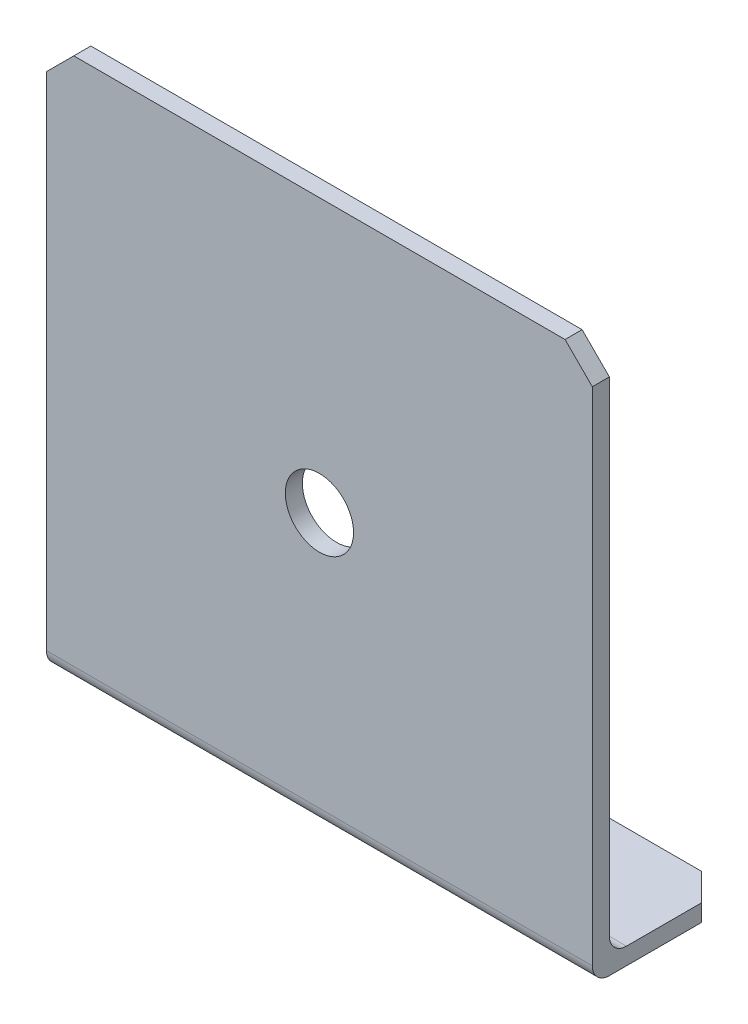
ISO-10303-21;
HEADER;
FILE_DESCRIPTION(('STEP AP214'),'2;1');
FILE_NAME('part.step','',(''),(''),'','','');
FILE_SCHEMA(('AUTOMOTIVE_DESIGN { 1 0 10303 214 1 1 1 1 }'));
ENDSEC;
DATA;
#1=APPLICATION_CONTEXT('core data for automotive mechanical design processes');
#2=APPLICATION_PROTOCOL_DEFINITION('international standard','automotive_design',2000,#1);
#3=PRODUCT_CONTEXT('',#1,'mechanical');
#4=PRODUCT('Part','Part','',(#3));
#5=PRODUCT_RELATED_PRODUCT_CATEGORY('part','',(#4));
#6=PRODUCT_DEFINITION_FORMATION('','',#4);
#7=PRODUCT_DEFINITION_CONTEXT('part definition',#1,'design');
#8=PRODUCT_DEFINITION('design','',#6,#7);
#9=PRODUCT_DEFINITION_SHAPE('','',#8);
#10=(LENGTH_UNIT() NAMED_UNIT(*) SI_UNIT(.MILLI.,.METRE.));
#11=(NAMED_UNIT(*) PLANE_ANGLE_UNIT() SI_UNIT($,.RADIAN.));
#12=(NAMED_UNIT(*) SI_UNIT($,.STERADIAN.) SOLID_ANGLE_UNIT());
#13=UNCERTAINTY_MEASURE_WITH_UNIT(LENGTH_MEASURE(1.E-05),#10,'distance_accuracy_value','');
#14=(GEOMETRIC_REPRESENTATION_CONTEXT(3) GLOBAL_UNCERTAINTY_ASSIGNED_CONTEXT((#13)) GLOBAL_UNIT_ASSIGNED_CONTEXT((#10,
#11,#12)) REPRESENTATION_CONTEXT('',''));
#15=CARTESIAN_POINT('',(0.,0.,0.));
#16=DIRECTION('',(0.,0.,1.));
#17=DIRECTION('',(1.,0.,0.));
#18=AXIS2_PLACEMENT_3D('',#15,#16,#17);
#19=CARTESIAN_POINT('',(50.8,50.8,0.));
#20=DIRECTION('',(0.,-1.,0.));
#21=DIRECTION('',(0.,0.,-1.));
#22=AXIS2_PLACEMENT_3D('',#19,#20,#21);
#23=PLANE('',#22);
#24=DIRECTION('',(-1.,0.,0.));
#25=VECTOR('',#24,1.);
#26=CARTESIAN_POINT('',(50.8,50.8,-1.5875));
#27=LINE('',#26,#25);
#28=CARTESIAN_POINT('',(48.26,50.8,-1.5875));
#29=VERTEX_POINT('',#28);
#30=CARTESIAN_POINT('',(2.54,50.8,-1.5875));
#31=VERTEX_POINT('',#30);
#32=EDGE_CURVE('E166',#29,#31,#27,.T.);
#33=ORIENTED_EDGE('',*,*,#32,.T.);
#34=DIRECTION('',(0.,0.,1.));
#35=VECTOR('',#34,1.);
#36=CARTESIAN_POINT('',(2.54,50.8,0.));
#37=LINE('',#36,#35);
#38=CARTESIAN_POINT('',(2.54,50.8,0.));
#39=VERTEX_POINT('',#38);
#40=EDGE_CURVE('E226',#31,#39,#37,.T.);
#41=ORIENTED_EDGE('',*,*,#40,.T.);
#42=DIRECTION('',(-1.,0.,0.));
#43=VECTOR('',#42,1.);
#44=CARTESIAN_POINT('',(50.8,50.8,0.));
#45=LINE('',#44,#43);
#46=CARTESIAN_POINT('',(48.26,50.8,0.));
#47=VERTEX_POINT('',#46);
#48=EDGE_CURVE('E149',#47,#39,#45,.T.);
#49=ORIENTED_EDGE('',*,*,#48,.F.);
#50=DIRECTION('',(0.,0.,-1.));
#51=VECTOR('',#50,1.);
#52=CARTESIAN_POINT('',(48.26,50.8,0.));
#53=LINE('',#52,#51);
#54=EDGE_CURVE('E224',#47,#29,#53,.T.);
#55=ORIENTED_EDGE('',*,*,#54,.T.);
#56=EDGE_LOOP('',(#33,#41,#49,#55));
#57=FACE_BOUND('',#56,.T.);
#58=ADVANCED_FACE('F40',(#57),#23,.F.);
#59=CARTESIAN_POINT('',(50.8,1.5875,0.));
#60=DIRECTION('',(0.,0.,-1.));
#61=DIRECTION('',(0.,1.,0.));
#62=AXIS2_PLACEMENT_3D('',#59,#60,#61);
#63=PLANE('',#62);
#64=CARTESIAN_POINT('',(25.4,25.4,0.));
#65=DIRECTION('',(0.,0.,1.));
#66=DIRECTION('',(1.,0.,0.));
#67=AXIS2_PLACEMENT_3D('',#64,#65,#66);
#68=CIRCLE('',#67,3.175);
#69=CARTESIAN_POINT('',(28.575,25.4,0.));
#70=VERTEX_POINT('',#69);
#71=EDGE_CURVE('E207',#70,#70,#68,.T.);
#72=ORIENTED_EDGE('',*,*,#71,.F.);
#73=EDGE_LOOP('',(#72));
#74=FACE_BOUND('',#73,.T.);
#75=ORIENTED_EDGE('',*,*,#48,.T.);
#76=DIRECTION('',(-0.707106781186547,-0.707106781186548,0.));
#77=VECTOR('',#76,1.);
#78=CARTESIAN_POINT('',(2.54,50.8,0.));
#79=LINE('',#78,#77);
#80=CARTESIAN_POINT('',(0.,48.26,0.));
#81=VERTEX_POINT('',#80);
#82=EDGE_CURVE('E230',#39,#81,#79,.T.);
#83=ORIENTED_EDGE('',*,*,#82,.T.);
#84=DIRECTION('',(0.,-1.,0.));
#85=VECTOR('',#84,1.);
#86=CARTESIAN_POINT('',(0.,1.5875,0.));
#87=LINE('',#86,#85);
#88=CARTESIAN_POINT('',(0.,1.5875,0.));
#89=VERTEX_POINT('',#88);
#90=EDGE_CURVE('E146',#81,#89,#87,.T.);
#91=ORIENTED_EDGE('',*,*,#90,.T.);
#92=DIRECTION('',(-1.,0.,0.));
#93=VECTOR('',#92,1.);
#94=CARTESIAN_POINT('',(50.8,1.5875,0.));
#95=LINE('',#94,#93);
#96=CARTESIAN_POINT('',(50.8,1.5875,0.));
#97=VERTEX_POINT('',#96);
#98=EDGE_CURVE('E142',#97,#89,#95,.T.);
#99=ORIENTED_EDGE('',*,*,#98,.F.);
#100=DIRECTION('',(0.,-1.,0.));
#101=VECTOR('',#100,1.);
#102=CARTESIAN_POINT('',(50.8,1.5875,0.));
#103=LINE('',#102,#101);
#104=CARTESIAN_POINT('',(50.8,48.26,0.));
#105=VERTEX_POINT('',#104);
#106=EDGE_CURVE('E131',#105,#97,#103,.T.);
#107=ORIENTED_EDGE('',*,*,#106,.F.);
#108=DIRECTION('',(0.707106781186548,-0.707106781186547,0.));
#109=VECTOR('',#108,1.);
#110=CARTESIAN_POINT('',(50.8,48.26,0.));
#111=LINE('',#110,#109);
#112=EDGE_CURVE('E64',#105,#47,#111,.F.);
#113=ORIENTED_EDGE('',*,*,#112,.T.);
#114=EDGE_LOOP('',(#75,#83,#91,#99,#107,#113));
#115=FACE_BOUND('',#114,.T.);
#116=ADVANCED_FACE('F144',(#74,#115),#63,.F.);
#117=CARTESIAN_POINT('',(50.8,1.5875,-1.5875));
#118=DIRECTION('',(-1.,0.,0.));
#119=DIRECTION('',(0.,0.,1.));
#120=AXIS2_PLACEMENT_3D('',#117,#118,#119);
#121=CYLINDRICAL_SURFACE('',#120,1.5875);
#122=CARTESIAN_POINT('',(0.,1.5875,-1.5875));
#123=DIRECTION('',(1.,0.,0.));
#124=DIRECTION('',(0.,0.,1.));
#125=AXIS2_PLACEMENT_3D('',#122,#123,#124);
#126=CIRCLE('',#125,1.5875);
#127=CARTESIAN_POINT('',(0.,0.,-1.5875));
#128=VERTEX_POINT('',#127);
#129=EDGE_CURVE('E168',#89,#128,#126,.T.);
#130=ORIENTED_EDGE('',*,*,#129,.T.);
#131=DIRECTION('',(-1.,0.,0.));
#132=VECTOR('',#131,1.);
#133=CARTESIAN_POINT('',(50.8,0.,-1.5875));
#134=LINE('',#133,#132);
#135=CARTESIAN_POINT('',(50.8,0.,-1.5875));
#136=VERTEX_POINT('',#135);
#137=EDGE_CURVE('E150',#136,#128,#134,.T.);
#138=ORIENTED_EDGE('',*,*,#137,.F.);
#139=CARTESIAN_POINT('',(50.8,1.5875,-1.5875));
#140=DIRECTION('',(1.,0.,0.));
#141=DIRECTION('',(0.,0.,1.));
#142=AXIS2_PLACEMENT_3D('',#139,#140,#141);
#143=CIRCLE('',#142,1.5875);
#144=EDGE_CURVE('E136',#97,#136,#143,.T.);
#145=ORIENTED_EDGE('',*,*,#144,.F.);
#146=ORIENTED_EDGE('',*,*,#98,.T.);
#147=EDGE_LOOP('',(#130,#138,#145,#146));
#148=FACE_BOUND('',#147,.T.);
#149=ADVANCED_FACE('F152',(#148),#121,.T.);
#150=CARTESIAN_POINT('',(50.8,0.,-12.7));
#151=DIRECTION('',(0.,1.,0.));
#152=DIRECTION('',(0.,0.,1.));
#153=AXIS2_PLACEMENT_3D('',#150,#151,#152);
#154=PLANE('',#153);
#155=CARTESIAN_POINT('',(38.1,0.,-6.35));
#156=DIRECTION('',(0.,-1.,0.));
#157=DIRECTION('',(0.,0.,-1.));
#158=AXIS2_PLACEMENT_3D('',#155,#156,#157);
#159=CIRCLE('',#158,2.54);
#160=CARTESIAN_POINT('',(38.1,0.,-8.89));
#161=VERTEX_POINT('',#160);
#162=EDGE_CURVE('E200',#161,#161,#159,.T.);
#163=ORIENTED_EDGE('',*,*,#162,.F.);
#164=EDGE_LOOP('',(#163));
#165=FACE_BOUND('',#164,.T.);
#166=CARTESIAN_POINT('',(12.7,0.,-6.35));
#167=DIRECTION('',(0.,-1.,0.));
#168=DIRECTION('',(0.,0.,-1.));
#169=AXIS2_PLACEMENT_3D('',#166,#167,#168);
#170=CIRCLE('',#169,2.54);
#171=CARTESIAN_POINT('',(12.7,0.,-8.89));
#172=VERTEX_POINT('',#171);
#173=EDGE_CURVE('E206',#172,#172,#170,.T.);
#174=ORIENTED_EDGE('',*,*,#173,.F.);
#175=EDGE_LOOP('',(#174));
#176=FACE_BOUND('',#175,.T.);
#177=DIRECTION('',(0.,0.,-1.));
#178=VECTOR('',#177,1.);
#179=CARTESIAN_POINT('',(0.,0.,-12.7));
#180=LINE('',#179,#178);
#181=CARTESIAN_POINT('',(0.,0.,-10.16));
#182=VERTEX_POINT('',#181);
#183=EDGE_CURVE('E171',#128,#182,#180,.T.);
#184=ORIENTED_EDGE('',*,*,#183,.T.);
#185=DIRECTION('',(0.707106781186547,0.,-0.707106781186549));
#186=VECTOR('',#185,1.);
#187=CARTESIAN_POINT('',(2.54000000000001,0.,-12.7));
#188=LINE('',#187,#186);
#189=CARTESIAN_POINT('',(2.54000000000001,0.,-12.7));
#190=VERTEX_POINT('',#189);
#191=EDGE_CURVE('E222',#182,#190,#188,.T.);
#192=ORIENTED_EDGE('',*,*,#191,.T.);
#193=DIRECTION('',(-1.,0.,0.));
#194=VECTOR('',#193,1.);
#195=CARTESIAN_POINT('',(50.8,0.,-12.7));
#196=LINE('',#195,#194);
#197=CARTESIAN_POINT('',(48.26,0.,-12.7));
#198=VERTEX_POINT('',#197);
#199=EDGE_CURVE('E191',#198,#190,#196,.T.);
#200=ORIENTED_EDGE('',*,*,#199,.F.);
#201=DIRECTION('',(-0.707106781186548,0.,-0.707106781186547));
#202=VECTOR('',#201,1.);
#203=CARTESIAN_POINT('',(50.8,0.,-10.16));
#204=LINE('',#203,#202);
#205=CARTESIAN_POINT('',(50.8,0.,-10.16));
#206=VERTEX_POINT('',#205);
#207=EDGE_CURVE('E220',#198,#206,#204,.F.);
#208=ORIENTED_EDGE('',*,*,#207,.T.);
#209=DIRECTION('',(0.,0.,-1.));
#210=VECTOR('',#209,1.);
#211=CARTESIAN_POINT('',(50.8,0.,-12.7));
#212=LINE('',#211,#210);
#213=EDGE_CURVE('E155',#136,#206,#212,.T.);
#214=ORIENTED_EDGE('',*,*,#213,.F.);
#215=ORIENTED_EDGE('',*,*,#137,.T.);
#216=EDGE_LOOP('',(#184,#192,#200,#208,#214,#215));
#217=FACE_BOUND('',#216,.T.);
#218=ADVANCED_FACE('F263',(#165,#176,#217),#154,.F.);
#219=CARTESIAN_POINT('',(50.8,1.5875,-12.7));
#220=DIRECTION('',(0.,0.,1.));
#221=DIRECTION('',(1.,0.,0.));
#222=AXIS2_PLACEMENT_3D('',#219,#220,#221);
#223=PLANE('',#222);
#224=ORIENTED_EDGE('',*,*,#199,.T.);
#225=DIRECTION('',(0.,1.,0.));
#226=VECTOR('',#225,1.);
#227=CARTESIAN_POINT('',(2.54000000000001,1.5875,-12.7));
#228=LINE('',#227,#226);
#229=CARTESIAN_POINT('',(2.54000000000001,1.5875,-12.7));
#230=VERTEX_POINT('',#229);
#231=EDGE_CURVE('E209',#190,#230,#228,.T.);
#232=ORIENTED_EDGE('',*,*,#231,.T.);
#233=DIRECTION('',(-1.,0.,0.));
#234=VECTOR('',#233,1.);
#235=CARTESIAN_POINT('',(50.8,1.5875,-12.7));
#236=LINE('',#235,#234);
#237=CARTESIAN_POINT('',(48.26,1.5875,-12.7));
#238=VERTEX_POINT('',#237);
#239=EDGE_CURVE('E188',#238,#230,#236,.T.);
#240=ORIENTED_EDGE('',*,*,#239,.F.);
#241=DIRECTION('',(0.,-1.,0.));
#242=VECTOR('',#241,1.);
#243=CARTESIAN_POINT('',(48.26,1.5875,-12.7));
#244=LINE('',#243,#242);
#245=EDGE_CURVE('E196',#238,#198,#244,.T.);
#246=ORIENTED_EDGE('',*,*,#245,.T.);
#247=EDGE_LOOP('',(#224,#232,#240,#246));
#248=FACE_BOUND('',#247,.T.);
#249=ADVANCED_FACE('F268',(#248),#223,.F.);
#250=CARTESIAN_POINT('',(50.8,1.5875,-3.17500000000001));
#251=DIRECTION('',(0.,-1.,0.));
#252=DIRECTION('',(0.,0.,-1.));
#253=AXIS2_PLACEMENT_3D('',#250,#251,#252);
#254=PLANE('',#253);
#255=CARTESIAN_POINT('',(38.1,1.5875,-6.35));
#256=DIRECTION('',(0.,-1.,0.));
#257=DIRECTION('',(0.,0.,-1.));
#258=AXIS2_PLACEMENT_3D('',#255,#256,#257);
#259=CIRCLE('',#258,2.54);
#260=CARTESIAN_POINT('',(38.1,1.5875,-8.89));
#261=VERTEX_POINT('',#260);
#262=EDGE_CURVE('E169',#261,#261,#259,.T.);
#263=ORIENTED_EDGE('',*,*,#262,.T.);
#264=EDGE_LOOP('',(#263));
#265=FACE_BOUND('',#264,.T.);
#266=CARTESIAN_POINT('',(12.7,1.5875,-6.35));
#267=DIRECTION('',(0.,-1.,0.));
#268=DIRECTION('',(0.,0.,-1.));
#269=AXIS2_PLACEMENT_3D('',#266,#267,#268);
#270=CIRCLE('',#269,2.54);
#271=CARTESIAN_POINT('',(12.7,1.5875,-8.89));
#272=VERTEX_POINT('',#271);
#273=EDGE_CURVE('E197',#272,#272,#270,.T.);
#274=ORIENTED_EDGE('',*,*,#273,.T.);
#275=EDGE_LOOP('',(#274));
#276=FACE_BOUND('',#275,.T.);
#277=ORIENTED_EDGE('',*,*,#239,.T.);
#278=DIRECTION('',(-0.707106781186547,0.,0.707106781186549));
#279=VECTOR('',#278,1.);
#280=CARTESIAN_POINT('',(2.54000000000001,1.5875,-12.7));
#281=LINE('',#280,#279);
#282=CARTESIAN_POINT('',(0.,1.5875,-10.16));
#283=VERTEX_POINT('',#282);
#284=EDGE_CURVE('E214',#230,#283,#281,.T.);
#285=ORIENTED_EDGE('',*,*,#284,.T.);
#286=DIRECTION('',(0.,0.,1.));
#287=VECTOR('',#286,1.);
#288=CARTESIAN_POINT('',(0.,1.5875,-3.17500000000001));
#289=LINE('',#288,#287);
#290=CARTESIAN_POINT('',(0.,1.5875,-3.17500000000001));
#291=VERTEX_POINT('',#290);
#292=EDGE_CURVE('E174',#283,#291,#289,.T.);
#293=ORIENTED_EDGE('',*,*,#292,.T.);
#294=DIRECTION('',(-1.,0.,0.));
#295=VECTOR('',#294,1.);
#296=CARTESIAN_POINT('',(50.8,1.5875,-3.17500000000001));
#297=LINE('',#296,#295);
#298=CARTESIAN_POINT('',(50.8,1.5875,-3.17500000000001));
#299=VERTEX_POINT('',#298);
#300=EDGE_CURVE('E185',#299,#291,#297,.T.);
#301=ORIENTED_EDGE('',*,*,#300,.F.);
#302=DIRECTION('',(0.,0.,1.));
#303=VECTOR('',#302,1.);
#304=CARTESIAN_POINT('',(50.8,1.5875,-3.17500000000001));
#305=LINE('',#304,#303);
#306=CARTESIAN_POINT('',(50.8,1.5875,-10.16));
#307=VERTEX_POINT('',#306);
#308=EDGE_CURVE('E157',#307,#299,#305,.T.);
#309=ORIENTED_EDGE('',*,*,#308,.F.);
#310=DIRECTION('',(0.707106781186548,0.,0.707106781186547));
#311=VECTOR('',#310,1.);
#312=CARTESIAN_POINT('',(50.8,1.5875,-10.16));
#313=LINE('',#312,#311);
#314=EDGE_CURVE('E212',#307,#238,#313,.F.);
#315=ORIENTED_EDGE('',*,*,#314,.T.);
#316=EDGE_LOOP('',(#277,#285,#293,#301,#309,#315));
#317=FACE_BOUND('',#316,.T.);
#318=ADVANCED_FACE('F241',(#265,#276,#317),#254,.F.);
#319=CARTESIAN_POINT('',(50.8,3.175,-3.17500000000001));
#320=DIRECTION('',(-1.,0.,0.));
#321=DIRECTION('',(0.,0.,1.));
#322=AXIS2_PLACEMENT_3D('',#319,#320,#321);
#323=CYLINDRICAL_SURFACE('',#322,1.5875);
#324=CARTESIAN_POINT('',(0.,3.175,-3.17500000000001));
#325=DIRECTION('',(-1.,0.,0.));
#326=DIRECTION('',(0.,0.,1.));
#327=AXIS2_PLACEMENT_3D('',#324,#325,#326);
#328=CIRCLE('',#327,1.5875);
#329=CARTESIAN_POINT('',(0.,3.175,-1.58750000000001));
#330=VERTEX_POINT('',#329);
#331=EDGE_CURVE('E176',#291,#330,#328,.T.);
#332=ORIENTED_EDGE('',*,*,#331,.T.);
#333=DIRECTION('',(-1.,0.,0.));
#334=VECTOR('',#333,1.);
#335=CARTESIAN_POINT('',(50.8,3.175,-1.58750000000001));
#336=LINE('',#335,#334);
#337=CARTESIAN_POINT('',(50.8,3.175,-1.58750000000001));
#338=VERTEX_POINT('',#337);
#339=EDGE_CURVE('E182',#338,#330,#336,.T.);
#340=ORIENTED_EDGE('',*,*,#339,.F.);
#341=CARTESIAN_POINT('',(50.8,3.175,-3.17500000000001));
#342=DIRECTION('',(-1.,0.,0.));
#343=DIRECTION('',(0.,0.,1.));
#344=AXIS2_PLACEMENT_3D('',#341,#342,#343);
#345=CIRCLE('',#344,1.5875);
#346=EDGE_CURVE('E162',#299,#338,#345,.T.);
#347=ORIENTED_EDGE('',*,*,#346,.F.);
#348=ORIENTED_EDGE('',*,*,#300,.T.);
#349=EDGE_LOOP('',(#332,#340,#347,#348));
#350=FACE_BOUND('',#349,.T.);
#351=ADVANCED_FACE('F248',(#350),#323,.F.);
#352=CARTESIAN_POINT('',(50.8,50.8,-1.5875));
#353=DIRECTION('',(0.,0.,1.));
#354=DIRECTION('',(0.,-1.,0.));
#355=AXIS2_PLACEMENT_3D('',#352,#353,#354);
#356=PLANE('',#355);
#357=CARTESIAN_POINT('',(25.4,25.4,-1.5875));
#358=DIRECTION('',(0.,0.,1.));
#359=DIRECTION('',(0.,-1.,0.));
#360=AXIS2_PLACEMENT_3D('',#357,#358,#359);
#361=CIRCLE('',#360,3.175);
#362=CARTESIAN_POINT('',(25.4,22.225,-1.5875));
#363=VERTEX_POINT('',#362);
#364=EDGE_CURVE('E203',#363,#363,#361,.T.);
#365=ORIENTED_EDGE('',*,*,#364,.T.);
#366=EDGE_LOOP('',(#365));
#367=FACE_BOUND('',#366,.T.);
#368=DIRECTION('',(0.,1.,0.));
#369=VECTOR('',#368,1.);
#370=CARTESIAN_POINT('',(0.,50.8,-1.5875));
#371=LINE('',#370,#369);
#372=CARTESIAN_POINT('',(0.,48.26,-1.5875));
#373=VERTEX_POINT('',#372);
#374=EDGE_CURVE('E139',#330,#373,#371,.T.);
#375=ORIENTED_EDGE('',*,*,#374,.T.);
#376=DIRECTION('',(0.707106781186547,0.707106781186548,0.));
#377=VECTOR('',#376,1.);
#378=CARTESIAN_POINT('',(2.54,50.8,-1.5875));
#379=LINE('',#378,#377);
#380=EDGE_CURVE('E233',#373,#31,#379,.T.);
#381=ORIENTED_EDGE('',*,*,#380,.T.);
#382=ORIENTED_EDGE('',*,*,#32,.F.);
#383=DIRECTION('',(-0.707106781186548,0.707106781186547,0.));
#384=VECTOR('',#383,1.);
#385=CARTESIAN_POINT('',(50.8,48.26,-1.5875));
#386=LINE('',#385,#384);
#387=CARTESIAN_POINT('',(50.8,48.26,-1.5875));
#388=VERTEX_POINT('',#387);
#389=EDGE_CURVE('E56',#29,#388,#386,.F.);
#390=ORIENTED_EDGE('',*,*,#389,.T.);
#391=DIRECTION('',(0.,1.,0.));
#392=VECTOR('',#391,1.);
#393=CARTESIAN_POINT('',(50.8,50.8,-1.5875));
#394=LINE('',#393,#392);
#395=EDGE_CURVE('E164',#338,#388,#394,.T.);
#396=ORIENTED_EDGE('',*,*,#395,.F.);
#397=ORIENTED_EDGE('',*,*,#339,.T.);
#398=EDGE_LOOP('',(#375,#381,#382,#390,#396,#397));
#399=FACE_BOUND('',#398,.T.);
#400=ADVANCED_FACE('F253',(#367,#399),#356,.F.);
#401=CARTESIAN_POINT('',(50.8,3.175,-3.17500000000001));
#402=DIRECTION('',(-1.,0.,0.));
#403=DIRECTION('',(0.,0.,1.));
#404=AXIS2_PLACEMENT_3D('',#401,#402,#403);
#405=PLANE('',#404);
#406=ORIENTED_EDGE('',*,*,#395,.T.);
#407=DIRECTION('',(0.,0.,1.));
#408=VECTOR('',#407,1.);
#409=CARTESIAN_POINT('',(50.8,48.26,-3.17500000000001));
#410=LINE('',#409,#408);
#411=EDGE_CURVE('E11',#388,#105,#410,.T.);
#412=ORIENTED_EDGE('',*,*,#411,.T.);
#413=ORIENTED_EDGE('',*,*,#106,.T.);
#414=ORIENTED_EDGE('',*,*,#144,.T.);
#415=ORIENTED_EDGE('',*,*,#213,.T.);
#416=DIRECTION('',(0.,1.,0.));
#417=VECTOR('',#416,1.);
#418=CARTESIAN_POINT('',(50.8,3.175,-10.16));
#419=LINE('',#418,#417);
#420=EDGE_CURVE('E49',#206,#307,#419,.T.);
#421=ORIENTED_EDGE('',*,*,#420,.T.);
#422=ORIENTED_EDGE('',*,*,#308,.T.);
#423=ORIENTED_EDGE('',*,*,#346,.T.);
#424=EDGE_LOOP('',(#406,#412,#413,#414,#415,#421,#422,#423));
#425=FACE_BOUND('',#424,.T.);
#426=ADVANCED_FACE('F133',(#425),#405,.F.);
#427=CARTESIAN_POINT('',(0.,3.175,-3.17500000000001));
#428=DIRECTION('',(-1.,0.,0.));
#429=DIRECTION('',(0.,0.,1.));
#430=AXIS2_PLACEMENT_3D('',#427,#428,#429);
#431=PLANE('',#430);
#432=ORIENTED_EDGE('',*,*,#292,.F.);
#433=DIRECTION('',(0.,-1.,0.));
#434=VECTOR('',#433,1.);
#435=CARTESIAN_POINT('',(0.,0.,-10.16));
#436=LINE('',#435,#434);
#437=EDGE_CURVE('E218',#283,#182,#436,.T.);
#438=ORIENTED_EDGE('',*,*,#437,.T.);
#439=ORIENTED_EDGE('',*,*,#183,.F.);
#440=ORIENTED_EDGE('',*,*,#129,.F.);
#441=ORIENTED_EDGE('',*,*,#90,.F.);
#442=DIRECTION('',(0.,0.,-1.));
#443=VECTOR('',#442,1.);
#444=CARTESIAN_POINT('',(0.,48.26,-1.5875));
#445=LINE('',#444,#443);
#446=EDGE_CURVE('E216',#81,#373,#445,.T.);
#447=ORIENTED_EDGE('',*,*,#446,.T.);
#448=ORIENTED_EDGE('',*,*,#374,.F.);
#449=ORIENTED_EDGE('',*,*,#331,.F.);
#450=EDGE_LOOP('',(#432,#438,#439,#440,#441,#447,#448,#449));
#451=FACE_BOUND('',#450,.T.);
#452=ADVANCED_FACE('F260',(#451),#431,.T.);
#453=CARTESIAN_POINT('',(12.7,50.8,-6.34999999999999));
#454=DIRECTION('',(0.,-1.,0.));
#455=DIRECTION('',(0.,0.,-1.));
#456=AXIS2_PLACEMENT_3D('',#453,#454,#455);
#457=CYLINDRICAL_SURFACE('',#456,2.54);
#458=ORIENTED_EDGE('',*,*,#173,.T.);
#459=EDGE_LOOP('',(#458));
#460=FACE_BOUND('',#459,.T.);
#461=ORIENTED_EDGE('',*,*,#273,.F.);
#462=EDGE_LOOP('',(#461));
#463=FACE_BOUND('',#462,.T.);
#464=ADVANCED_FACE('F310',(#460,#463),#457,.F.);
#465=CARTESIAN_POINT('',(38.1,50.8,-6.34999999999999));
#466=DIRECTION('',(0.,-1.,0.));
#467=DIRECTION('',(0.,0.,-1.));
#468=AXIS2_PLACEMENT_3D('',#465,#466,#467);
#469=CYLINDRICAL_SURFACE('',#468,2.54);
#470=ORIENTED_EDGE('',*,*,#162,.T.);
#471=EDGE_LOOP('',(#470));
#472=FACE_BOUND('',#471,.T.);
#473=ORIENTED_EDGE('',*,*,#262,.F.);
#474=EDGE_LOOP('',(#473));
#475=FACE_BOUND('',#474,.T.);
#476=ADVANCED_FACE('F281',(#472,#475),#469,.F.);
#477=CARTESIAN_POINT('',(25.4,25.4,-12.7));
#478=DIRECTION('',(0.,0.,1.));
#479=DIRECTION('',(1.,0.,0.));
#480=AXIS2_PLACEMENT_3D('',#477,#478,#479);
#481=CYLINDRICAL_SURFACE('',#480,3.175);
#482=ORIENTED_EDGE('',*,*,#71,.T.);
#483=EDGE_LOOP('',(#482));
#484=FACE_BOUND('',#483,.T.);
#485=ORIENTED_EDGE('',*,*,#364,.F.);
#486=EDGE_LOOP('',(#485));
#487=FACE_BOUND('',#486,.T.);
#488=ADVANCED_FACE('F274',(#484,#487),#481,.F.);
#489=CARTESIAN_POINT('',(2.54000000000001,1.5875,-12.7));
#490=DIRECTION('',(-0.707106781186549,0.,-0.707106781186547));
#491=DIRECTION('',(0.,-1.,0.));
#492=AXIS2_PLACEMENT_3D('',#489,#490,#491);
#493=PLANE('',#492);
#494=ORIENTED_EDGE('',*,*,#191,.F.);
#495=ORIENTED_EDGE('',*,*,#437,.F.);
#496=ORIENTED_EDGE('',*,*,#284,.F.);
#497=ORIENTED_EDGE('',*,*,#231,.F.);
#498=EDGE_LOOP('',(#494,#495,#496,#497));
#499=FACE_BOUND('',#498,.T.);
#500=ADVANCED_FACE('F272',(#499),#493,.T.);
#501=CARTESIAN_POINT('',(2.54,50.8,0.));
#502=DIRECTION('',(-0.707106781186548,0.707106781186547,0.));
#503=DIRECTION('',(0.,0.,-1.));
#504=AXIS2_PLACEMENT_3D('',#501,#502,#503);
#505=PLANE('',#504);
#506=ORIENTED_EDGE('',*,*,#380,.F.);
#507=ORIENTED_EDGE('',*,*,#446,.F.);
#508=ORIENTED_EDGE('',*,*,#82,.F.);
#509=ORIENTED_EDGE('',*,*,#40,.F.);
#510=EDGE_LOOP('',(#506,#507,#508,#509));
#511=FACE_BOUND('',#510,.T.);
#512=ADVANCED_FACE('F258',(#511),#505,.T.);
#513=CARTESIAN_POINT('',(50.8,48.26,-3.17500000000001));
#514=DIRECTION('',(-0.707106781186547,-0.707106781186548,0.));
#515=DIRECTION('',(0.,0.,1.));
#516=AXIS2_PLACEMENT_3D('',#513,#514,#515);
#517=PLANE('',#516);
#518=ORIENTED_EDGE('',*,*,#389,.F.);
#519=ORIENTED_EDGE('',*,*,#54,.F.);
#520=ORIENTED_EDGE('',*,*,#112,.F.);
#521=ORIENTED_EDGE('',*,*,#411,.F.);
#522=EDGE_LOOP('',(#518,#519,#520,#521));
#523=FACE_BOUND('',#522,.T.);
#524=ADVANCED_FACE('F249',(#523),#517,.F.);
#525=CARTESIAN_POINT('',(50.8,3.175,-10.16));
#526=DIRECTION('',(-0.707106781186547,0.,0.707106781186548));
#527=DIRECTION('',(0.,1.,0.));
#528=AXIS2_PLACEMENT_3D('',#525,#526,#527);
#529=PLANE('',#528);
#530=ORIENTED_EDGE('',*,*,#207,.F.);
#531=ORIENTED_EDGE('',*,*,#245,.F.);
#532=ORIENTED_EDGE('',*,*,#314,.F.);
#533=ORIENTED_EDGE('',*,*,#420,.F.);
#534=EDGE_LOOP('',(#530,#531,#532,#533));
#535=FACE_BOUND('',#534,.T.);
#536=ADVANCED_FACE('F43',(#535),#529,.F.);
#537=CLOSED_SHELL('',(#58,#116,#149,#218,#249,#318,#351,#400,#426,#452,#464,#476,#488,#500,#512,
#524,#536));
#538=MANIFOLD_SOLID_BREP('B2',#537);
#539=ADVANCED_BREP_SHAPE_REPRESENTATION('',(#18,#538),#14);
#540=SHAPE_DEFINITION_REPRESENTATION(#9,#539);
ENDSEC;
END-ISO-10303-21;
